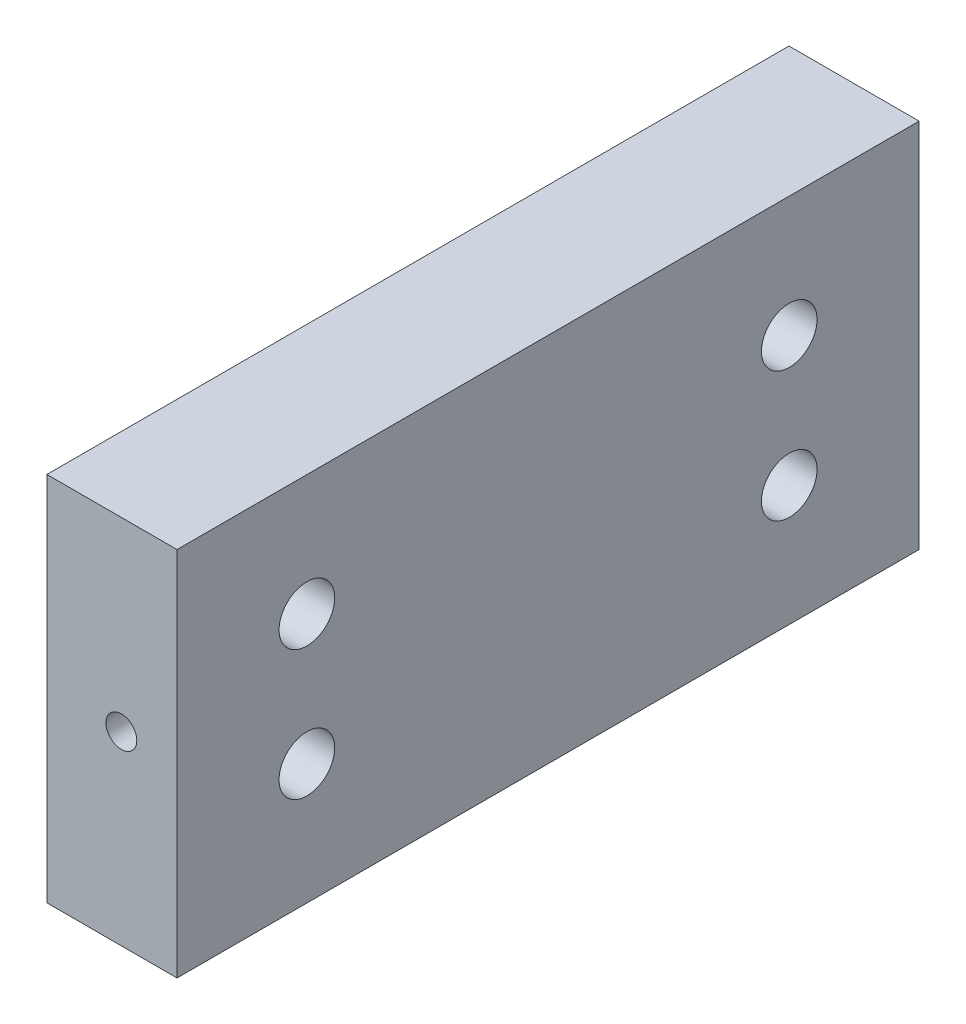
ISO-10303-21;
HEADER;
FILE_DESCRIPTION(('STEP AP214'),'2;1');
FILE_NAME('part.step','',(''),(''),'','','');
FILE_SCHEMA(('AUTOMOTIVE_DESIGN { 1 0 10303 214 1 1 1 1 }'));
ENDSEC;
DATA;
#1=APPLICATION_CONTEXT('core data for automotive mechanical design processes');
#2=APPLICATION_PROTOCOL_DEFINITION('international standard','automotive_design',2000,#1);
#3=PRODUCT_CONTEXT('',#1,'mechanical');
#4=PRODUCT('Part','Part','',(#3));
#5=PRODUCT_RELATED_PRODUCT_CATEGORY('part','',(#4));
#6=PRODUCT_DEFINITION_FORMATION('','',#4);
#7=PRODUCT_DEFINITION_CONTEXT('part definition',#1,'design');
#8=PRODUCT_DEFINITION('design','',#6,#7);
#9=PRODUCT_DEFINITION_SHAPE('','',#8);
#10=(LENGTH_UNIT() NAMED_UNIT(*) SI_UNIT(.MILLI.,.METRE.));
#11=(NAMED_UNIT(*) PLANE_ANGLE_UNIT() SI_UNIT($,.RADIAN.));
#12=(NAMED_UNIT(*) SI_UNIT($,.STERADIAN.) SOLID_ANGLE_UNIT());
#13=UNCERTAINTY_MEASURE_WITH_UNIT(LENGTH_MEASURE(1.E-05),#10,'distance_accuracy_value','');
#14=(GEOMETRIC_REPRESENTATION_CONTEXT(3) GLOBAL_UNCERTAINTY_ASSIGNED_CONTEXT((#13)) GLOBAL_UNIT_ASSIGNED_CONTEXT((#10,
#11,#12)) REPRESENTATION_CONTEXT('',''));
#15=CARTESIAN_POINT('',(0.,0.,0.));
#16=DIRECTION('',(0.,0.,1.));
#17=DIRECTION('',(1.,0.,0.));
#18=AXIS2_PLACEMENT_3D('',#15,#16,#17);
#19=CARTESIAN_POINT('',(-17.53472,-50.,200.));
#20=DIRECTION('',(1.,0.,0.));
#21=DIRECTION('',(0.,0.,-1.));
#22=AXIS2_PLACEMENT_3D('',#19,#20,#21);
#23=PLANE('',#22);
#24=CARTESIAN_POINT('',(-17.53472,-17.5,165.));
#25=DIRECTION('',(1.,0.,0.));
#26=DIRECTION('',(0.,0.,-1.));
#27=AXIS2_PLACEMENT_3D('',#24,#25,#26);
#28=CIRCLE('',#27,4.49999999999999);
#29=CARTESIAN_POINT('',(-17.53472,-17.5,160.5));
#30=VERTEX_POINT('',#29);
#31=EDGE_CURVE('E119',#30,#30,#28,.T.);
#32=ORIENTED_EDGE('',*,*,#31,.T.);
#33=EDGE_LOOP('',(#32));
#34=FACE_BOUND('',#33,.T.);
#35=CARTESIAN_POINT('',(-17.53472,-17.5,35.));
#36=DIRECTION('',(1.,0.,0.));
#37=DIRECTION('',(0.,0.,-1.));
#38=AXIS2_PLACEMENT_3D('',#35,#36,#37);
#39=CIRCLE('',#38,4.49999999999999);
#40=CARTESIAN_POINT('',(-17.53472,-17.5,30.5));
#41=VERTEX_POINT('',#40);
#42=EDGE_CURVE('E131',#41,#41,#39,.T.);
#43=ORIENTED_EDGE('',*,*,#42,.T.);
#44=EDGE_LOOP('',(#43));
#45=FACE_BOUND('',#44,.T.);
#46=CARTESIAN_POINT('',(-17.53472,17.5,35.));
#47=DIRECTION('',(1.,0.,0.));
#48=DIRECTION('',(0.,0.,-1.));
#49=AXIS2_PLACEMENT_3D('',#46,#47,#48);
#50=CIRCLE('',#49,4.49999999999999);
#51=CARTESIAN_POINT('',(-17.53472,17.5,30.5));
#52=VERTEX_POINT('',#51);
#53=EDGE_CURVE('E143',#52,#52,#50,.T.);
#54=ORIENTED_EDGE('',*,*,#53,.T.);
#55=EDGE_LOOP('',(#54));
#56=FACE_BOUND('',#55,.T.);
#57=CARTESIAN_POINT('',(-17.53472,17.5,165.));
#58=DIRECTION('',(1.,0.,0.));
#59=DIRECTION('',(0.,0.,-1.));
#60=AXIS2_PLACEMENT_3D('',#57,#58,#59);
#61=CIRCLE('',#60,4.49999999999999);
#62=CARTESIAN_POINT('',(-17.53472,17.5,160.5));
#63=VERTEX_POINT('',#62);
#64=EDGE_CURVE('E155',#63,#63,#61,.T.);
#65=ORIENTED_EDGE('',*,*,#64,.T.);
#66=EDGE_LOOP('',(#65));
#67=FACE_BOUND('',#66,.T.);
#68=DIRECTION('',(0.,-1.,0.));
#69=VECTOR('',#68,1.);
#70=CARTESIAN_POINT('',(-17.53472,-50.,0.));
#71=LINE('',#70,#69);
#72=CARTESIAN_POINT('',(-17.53472,50.,0.));
#73=VERTEX_POINT('',#72);
#74=CARTESIAN_POINT('',(-17.53472,-50.,0.));
#75=VERTEX_POINT('',#74);
#76=EDGE_CURVE('E158',#73,#75,#71,.T.);
#77=ORIENTED_EDGE('',*,*,#76,.T.);
#78=DIRECTION('',(0.,0.,-1.));
#79=VECTOR('',#78,1.);
#80=CARTESIAN_POINT('',(-17.53472,-50.,200.));
#81=LINE('',#80,#79);
#82=CARTESIAN_POINT('',(-17.53472,-50.,200.));
#83=VERTEX_POINT('',#82);
#84=EDGE_CURVE('E13',#83,#75,#81,.T.);
#85=ORIENTED_EDGE('',*,*,#84,.F.);
#86=DIRECTION('',(0.,-1.,0.));
#87=VECTOR('',#86,1.);
#88=CARTESIAN_POINT('',(-17.53472,-50.,200.));
#89=LINE('',#88,#87);
#90=CARTESIAN_POINT('',(-17.53472,50.,200.));
#91=VERTEX_POINT('',#90);
#92=EDGE_CURVE('E159',#91,#83,#89,.T.);
#93=ORIENTED_EDGE('',*,*,#92,.F.);
#94=DIRECTION('',(0.,0.,-1.));
#95=VECTOR('',#94,1.);
#96=CARTESIAN_POINT('',(-17.53472,50.,200.));
#97=LINE('',#96,#95);
#98=EDGE_CURVE('E165',#91,#73,#97,.T.);
#99=ORIENTED_EDGE('',*,*,#98,.T.);
#100=EDGE_LOOP('',(#77,#85,#93,#99));
#101=FACE_BOUND('',#100,.T.);
#102=ADVANCED_FACE('F44',(#34,#45,#56,#67,#101),#23,.F.);
#103=CARTESIAN_POINT('',(17.53472,-50.,200.));
#104=DIRECTION('',(0.,1.,0.));
#105=DIRECTION('',(-1.,0.,0.));
#106=AXIS2_PLACEMENT_3D('',#103,#104,#105);
#107=PLANE('',#106);
#108=DIRECTION('',(1.,0.,0.));
#109=VECTOR('',#108,1.);
#110=CARTESIAN_POINT('',(17.53472,-50.,0.));
#111=LINE('',#110,#109);
#112=CARTESIAN_POINT('',(17.53472,-50.,0.));
#113=VERTEX_POINT('',#112);
#114=EDGE_CURVE('E168',#75,#113,#111,.T.);
#115=ORIENTED_EDGE('',*,*,#114,.T.);
#116=DIRECTION('',(0.,0.,-1.));
#117=VECTOR('',#116,1.);
#118=CARTESIAN_POINT('',(17.53472,-50.,200.));
#119=LINE('',#118,#117);
#120=CARTESIAN_POINT('',(17.53472,-50.,200.));
#121=VERTEX_POINT('',#120);
#122=EDGE_CURVE('E52',#121,#113,#119,.T.);
#123=ORIENTED_EDGE('',*,*,#122,.F.);
#124=DIRECTION('',(1.,0.,0.));
#125=VECTOR('',#124,1.);
#126=CARTESIAN_POINT('',(17.53472,-50.,200.));
#127=LINE('',#126,#125);
#128=EDGE_CURVE('E91',#83,#121,#127,.T.);
#129=ORIENTED_EDGE('',*,*,#128,.F.);
#130=ORIENTED_EDGE('',*,*,#84,.T.);
#131=EDGE_LOOP('',(#115,#123,#129,#130));
#132=FACE_BOUND('',#131,.T.);
#133=ADVANCED_FACE('F193',(#132),#107,.F.);
#134=CARTESIAN_POINT('',(17.53472,-50.,200.));
#135=DIRECTION('',(-1.,0.,0.));
#136=DIRECTION('',(0.,0.,1.));
#137=AXIS2_PLACEMENT_3D('',#134,#135,#136);
#138=PLANE('',#137);
#139=CARTESIAN_POINT('',(17.53472,-17.5,165.));
#140=DIRECTION('',(1.,0.,0.));
#141=DIRECTION('',(0.,0.,-1.));
#142=AXIS2_PLACEMENT_3D('',#139,#140,#141);
#143=CIRCLE('',#142,7.5);
#144=CARTESIAN_POINT('',(17.53472,-17.5,157.5));
#145=VERTEX_POINT('',#144);
#146=EDGE_CURVE('E105',#145,#145,#143,.T.);
#147=ORIENTED_EDGE('',*,*,#146,.F.);
#148=EDGE_LOOP('',(#147));
#149=FACE_BOUND('',#148,.T.);
#150=CARTESIAN_POINT('',(17.53472,-17.5,35.));
#151=DIRECTION('',(1.,0.,0.));
#152=DIRECTION('',(0.,0.,-1.));
#153=AXIS2_PLACEMENT_3D('',#150,#151,#152);
#154=CIRCLE('',#153,7.5);
#155=CARTESIAN_POINT('',(17.53472,-17.5,27.5));
#156=VERTEX_POINT('',#155);
#157=EDGE_CURVE('E122',#156,#156,#154,.T.);
#158=ORIENTED_EDGE('',*,*,#157,.F.);
#159=EDGE_LOOP('',(#158));
#160=FACE_BOUND('',#159,.T.);
#161=CARTESIAN_POINT('',(17.53472,17.5,35.));
#162=DIRECTION('',(1.,0.,0.));
#163=DIRECTION('',(0.,0.,-1.));
#164=AXIS2_PLACEMENT_3D('',#161,#162,#163);
#165=CIRCLE('',#164,7.5);
#166=CARTESIAN_POINT('',(17.53472,17.5,27.5));
#167=VERTEX_POINT('',#166);
#168=EDGE_CURVE('E134',#167,#167,#165,.T.);
#169=ORIENTED_EDGE('',*,*,#168,.F.);
#170=EDGE_LOOP('',(#169));
#171=FACE_BOUND('',#170,.T.);
#172=CARTESIAN_POINT('',(17.53472,17.5,165.));
#173=DIRECTION('',(1.,0.,0.));
#174=DIRECTION('',(0.,0.,-1.));
#175=AXIS2_PLACEMENT_3D('',#172,#173,#174);
#176=CIRCLE('',#175,7.5);
#177=CARTESIAN_POINT('',(17.53472,17.5,157.5));
#178=VERTEX_POINT('',#177);
#179=EDGE_CURVE('E146',#178,#178,#176,.T.);
#180=ORIENTED_EDGE('',*,*,#179,.F.);
#181=EDGE_LOOP('',(#180));
#182=FACE_BOUND('',#181,.T.);
#183=DIRECTION('',(0.,1.,0.));
#184=VECTOR('',#183,1.);
#185=CARTESIAN_POINT('',(17.53472,-50.,0.));
#186=LINE('',#185,#184);
#187=CARTESIAN_POINT('',(17.53472,50.,0.));
#188=VERTEX_POINT('',#187);
#189=EDGE_CURVE('E78',#113,#188,#186,.T.);
#190=ORIENTED_EDGE('',*,*,#189,.T.);
#191=DIRECTION('',(0.,0.,-1.));
#192=VECTOR('',#191,1.);
#193=CARTESIAN_POINT('',(17.53472,50.,200.));
#194=LINE('',#193,#192);
#195=CARTESIAN_POINT('',(17.53472,50.,200.));
#196=VERTEX_POINT('',#195);
#197=EDGE_CURVE('E173',#196,#188,#194,.T.);
#198=ORIENTED_EDGE('',*,*,#197,.F.);
#199=DIRECTION('',(0.,1.,0.));
#200=VECTOR('',#199,1.);
#201=CARTESIAN_POINT('',(17.53472,-50.,200.));
#202=LINE('',#201,#200);
#203=EDGE_CURVE('E162',#121,#196,#202,.T.);
#204=ORIENTED_EDGE('',*,*,#203,.F.);
#205=ORIENTED_EDGE('',*,*,#122,.T.);
#206=EDGE_LOOP('',(#190,#198,#204,#205));
#207=FACE_BOUND('',#206,.T.);
#208=ADVANCED_FACE('F175',(#149,#160,#171,#182,#207),#138,.F.);
#209=CARTESIAN_POINT('',(17.53472,50.,200.));
#210=DIRECTION('',(0.,-1.,0.));
#211=DIRECTION('',(0.,0.,-1.));
#212=AXIS2_PLACEMENT_3D('',#209,#210,#211);
#213=PLANE('',#212);
#214=DIRECTION('',(-1.,0.,0.));
#215=VECTOR('',#214,1.);
#216=CARTESIAN_POINT('',(17.53472,50.,0.));
#217=LINE('',#216,#215);
#218=EDGE_CURVE('E84',#188,#73,#217,.T.);
#219=ORIENTED_EDGE('',*,*,#218,.T.);
#220=ORIENTED_EDGE('',*,*,#98,.F.);
#221=DIRECTION('',(-1.,0.,0.));
#222=VECTOR('',#221,1.);
#223=CARTESIAN_POINT('',(17.53472,50.,200.));
#224=LINE('',#223,#222);
#225=EDGE_CURVE('E60',#196,#91,#224,.T.);
#226=ORIENTED_EDGE('',*,*,#225,.F.);
#227=ORIENTED_EDGE('',*,*,#197,.T.);
#228=EDGE_LOOP('',(#219,#220,#226,#227));
#229=FACE_BOUND('',#228,.T.);
#230=ADVANCED_FACE('F182',(#229),#213,.F.);
#231=CARTESIAN_POINT('',(0.,0.,200.));
#232=DIRECTION('',(0.,0.,1.));
#233=DIRECTION('',(1.,0.,0.));
#234=AXIS2_PLACEMENT_3D('',#231,#232,#233);
#235=PLANE('',#234);
#236=CARTESIAN_POINT('',(2.53472000000006,0.,200.));
#237=DIRECTION('',(0.,0.,1.));
#238=DIRECTION('',(1.,0.,0.));
#239=AXIS2_PLACEMENT_3D('',#236,#237,#238);
#240=CIRCLE('',#239,4.14999999999999);
#241=CARTESIAN_POINT('',(6.68472000000005,0.,200.));
#242=VERTEX_POINT('',#241);
#243=EDGE_CURVE('E106',#242,#242,#240,.T.);
#244=ORIENTED_EDGE('',*,*,#243,.F.);
#245=EDGE_LOOP('',(#244));
#246=FACE_BOUND('',#245,.T.);
#247=ORIENTED_EDGE('',*,*,#92,.T.);
#248=ORIENTED_EDGE('',*,*,#128,.T.);
#249=ORIENTED_EDGE('',*,*,#203,.T.);
#250=ORIENTED_EDGE('',*,*,#225,.T.);
#251=EDGE_LOOP('',(#247,#248,#249,#250));
#252=FACE_BOUND('',#251,.T.);
#253=ADVANCED_FACE('F184',(#246,#252),#235,.T.);
#254=CARTESIAN_POINT('',(0.,0.,0.));
#255=DIRECTION('',(0.,0.,1.));
#256=DIRECTION('',(1.,0.,0.));
#257=AXIS2_PLACEMENT_3D('',#254,#255,#256);
#258=PLANE('',#257);
#259=ORIENTED_EDGE('',*,*,#76,.F.);
#260=ORIENTED_EDGE('',*,*,#218,.F.);
#261=ORIENTED_EDGE('',*,*,#189,.F.);
#262=ORIENTED_EDGE('',*,*,#114,.F.);
#263=EDGE_LOOP('',(#259,#260,#261,#262));
#264=FACE_BOUND('',#263,.T.);
#265=ADVANCED_FACE('F178',(#264),#258,.F.);
#266=CARTESIAN_POINT('',(17.53472,17.5,165.));
#267=DIRECTION('',(1.,0.,0.));
#268=DIRECTION('',(0.,0.,-1.));
#269=AXIS2_PLACEMENT_3D('',#266,#267,#268);
#270=CYLINDRICAL_SURFACE('',#269,4.5);
#271=ORIENTED_EDGE('',*,*,#64,.F.);
#272=EDGE_LOOP('',(#271));
#273=FACE_BOUND('',#272,.T.);
#274=CARTESIAN_POINT('',(-7.46527999999998,17.5,165.));
#275=DIRECTION('',(1.,0.,0.));
#276=DIRECTION('',(0.,0.,-1.));
#277=AXIS2_PLACEMENT_3D('',#274,#275,#276);
#278=CIRCLE('',#277,4.5);
#279=CARTESIAN_POINT('',(-7.46527999999998,17.5,160.5));
#280=VERTEX_POINT('',#279);
#281=EDGE_CURVE('E152',#280,#280,#278,.T.);
#282=ORIENTED_EDGE('',*,*,#281,.T.);
#283=EDGE_LOOP('',(#282));
#284=FACE_BOUND('',#283,.T.);
#285=ADVANCED_FACE('F210',(#273,#284),#270,.F.);
#286=CARTESIAN_POINT('',(-7.46527999999998,22.,165.));
#287=DIRECTION('',(-1.,0.,0.));
#288=DIRECTION('',(0.,0.,1.));
#289=AXIS2_PLACEMENT_3D('',#286,#287,#288);
#290=PLANE('',#289);
#291=ORIENTED_EDGE('',*,*,#281,.F.);
#292=EDGE_LOOP('',(#291));
#293=FACE_BOUND('',#292,.T.);
#294=CARTESIAN_POINT('',(-7.46527999999998,17.5,165.));
#295=DIRECTION('',(1.,0.,0.));
#296=DIRECTION('',(0.,0.,-1.));
#297=AXIS2_PLACEMENT_3D('',#294,#295,#296);
#298=CIRCLE('',#297,7.49999999999999);
#299=CARTESIAN_POINT('',(-7.46527999999998,17.5,157.5));
#300=VERTEX_POINT('',#299);
#301=EDGE_CURVE('E149',#300,#300,#298,.T.);
#302=ORIENTED_EDGE('',*,*,#301,.T.);
#303=EDGE_LOOP('',(#302));
#304=FACE_BOUND('',#303,.T.);
#305=ADVANCED_FACE('F213',(#293,#304),#290,.F.);
#306=CARTESIAN_POINT('',(17.53472,17.5,165.));
#307=DIRECTION('',(1.,0.,0.));
#308=DIRECTION('',(0.,0.,-1.));
#309=AXIS2_PLACEMENT_3D('',#306,#307,#308);
#310=CYLINDRICAL_SURFACE('',#309,7.49999999999999);
#311=ORIENTED_EDGE('',*,*,#301,.F.);
#312=EDGE_LOOP('',(#311));
#313=FACE_BOUND('',#312,.T.);
#314=ORIENTED_EDGE('',*,*,#179,.T.);
#315=EDGE_LOOP('',(#314));
#316=FACE_BOUND('',#315,.T.);
#317=ADVANCED_FACE('F219',(#313,#316),#310,.F.);
#318=CARTESIAN_POINT('',(17.53472,17.5,35.));
#319=DIRECTION('',(1.,0.,0.));
#320=DIRECTION('',(0.,0.,-1.));
#321=AXIS2_PLACEMENT_3D('',#318,#319,#320);
#322=CYLINDRICAL_SURFACE('',#321,4.5);
#323=ORIENTED_EDGE('',*,*,#53,.F.);
#324=EDGE_LOOP('',(#323));
#325=FACE_BOUND('',#324,.T.);
#326=CARTESIAN_POINT('',(-7.46527999999998,17.5,35.));
#327=DIRECTION('',(1.,0.,0.));
#328=DIRECTION('',(0.,0.,-1.));
#329=AXIS2_PLACEMENT_3D('',#326,#327,#328);
#330=CIRCLE('',#329,4.5);
#331=CARTESIAN_POINT('',(-7.46527999999998,17.5,30.5));
#332=VERTEX_POINT('',#331);
#333=EDGE_CURVE('E140',#332,#332,#330,.T.);
#334=ORIENTED_EDGE('',*,*,#333,.T.);
#335=EDGE_LOOP('',(#334));
#336=FACE_BOUND('',#335,.T.);
#337=ADVANCED_FACE('F225',(#325,#336),#322,.F.);
#338=CARTESIAN_POINT('',(-7.46527999999998,22.,35.));
#339=DIRECTION('',(-1.,0.,0.));
#340=DIRECTION('',(0.,0.,1.));
#341=AXIS2_PLACEMENT_3D('',#338,#339,#340);
#342=PLANE('',#341);
#343=ORIENTED_EDGE('',*,*,#333,.F.);
#344=EDGE_LOOP('',(#343));
#345=FACE_BOUND('',#344,.T.);
#346=CARTESIAN_POINT('',(-7.46527999999998,17.5,35.));
#347=DIRECTION('',(1.,0.,0.));
#348=DIRECTION('',(0.,0.,-1.));
#349=AXIS2_PLACEMENT_3D('',#346,#347,#348);
#350=CIRCLE('',#349,7.49999999999999);
#351=CARTESIAN_POINT('',(-7.46527999999998,17.5,27.5));
#352=VERTEX_POINT('',#351);
#353=EDGE_CURVE('E137',#352,#352,#350,.T.);
#354=ORIENTED_EDGE('',*,*,#353,.T.);
#355=EDGE_LOOP('',(#354));
#356=FACE_BOUND('',#355,.T.);
#357=ADVANCED_FACE('F232',(#345,#356),#342,.F.);
#358=CARTESIAN_POINT('',(17.53472,17.5,35.));
#359=DIRECTION('',(1.,0.,0.));
#360=DIRECTION('',(0.,0.,-1.));
#361=AXIS2_PLACEMENT_3D('',#358,#359,#360);
#362=CYLINDRICAL_SURFACE('',#361,7.49999999999999);
#363=ORIENTED_EDGE('',*,*,#353,.F.);
#364=EDGE_LOOP('',(#363));
#365=FACE_BOUND('',#364,.T.);
#366=ORIENTED_EDGE('',*,*,#168,.T.);
#367=EDGE_LOOP('',(#366));
#368=FACE_BOUND('',#367,.T.);
#369=ADVANCED_FACE('F268',(#365,#368),#362,.F.);
#370=CARTESIAN_POINT('',(17.53472,-17.5,35.));
#371=DIRECTION('',(1.,0.,0.));
#372=DIRECTION('',(0.,0.,-1.));
#373=AXIS2_PLACEMENT_3D('',#370,#371,#372);
#374=CYLINDRICAL_SURFACE('',#373,4.49999999999999);
#375=ORIENTED_EDGE('',*,*,#42,.F.);
#376=EDGE_LOOP('',(#375));
#377=FACE_BOUND('',#376,.T.);
#378=CARTESIAN_POINT('',(-7.46527999999998,-17.5,35.));
#379=DIRECTION('',(1.,0.,0.));
#380=DIRECTION('',(0.,0.,-1.));
#381=AXIS2_PLACEMENT_3D('',#378,#379,#380);
#382=CIRCLE('',#381,4.5);
#383=CARTESIAN_POINT('',(-7.46527999999998,-17.5,30.5));
#384=VERTEX_POINT('',#383);
#385=EDGE_CURVE('E128',#384,#384,#382,.T.);
#386=ORIENTED_EDGE('',*,*,#385,.T.);
#387=EDGE_LOOP('',(#386));
#388=FACE_BOUND('',#387,.T.);
#389=ADVANCED_FACE('F276',(#377,#388),#374,.F.);
#390=CARTESIAN_POINT('',(-7.46527999999998,-13.,35.));
#391=DIRECTION('',(-1.,0.,0.));
#392=DIRECTION('',(0.,0.,1.));
#393=AXIS2_PLACEMENT_3D('',#390,#391,#392);
#394=PLANE('',#393);
#395=ORIENTED_EDGE('',*,*,#385,.F.);
#396=EDGE_LOOP('',(#395));
#397=FACE_BOUND('',#396,.T.);
#398=CARTESIAN_POINT('',(-7.46527999999998,-17.5,35.));
#399=DIRECTION('',(1.,0.,0.));
#400=DIRECTION('',(0.,0.,-1.));
#401=AXIS2_PLACEMENT_3D('',#398,#399,#400);
#402=CIRCLE('',#401,7.49999999999999);
#403=CARTESIAN_POINT('',(-7.46527999999998,-17.5,27.5));
#404=VERTEX_POINT('',#403);
#405=EDGE_CURVE('E125',#404,#404,#402,.T.);
#406=ORIENTED_EDGE('',*,*,#405,.T.);
#407=EDGE_LOOP('',(#406));
#408=FACE_BOUND('',#407,.T.);
#409=ADVANCED_FACE('F299',(#397,#408),#394,.F.);
#410=CARTESIAN_POINT('',(17.53472,-17.5,35.));
#411=DIRECTION('',(1.,0.,0.));
#412=DIRECTION('',(0.,0.,-1.));
#413=AXIS2_PLACEMENT_3D('',#410,#411,#412);
#414=CYLINDRICAL_SURFACE('',#413,7.5);
#415=ORIENTED_EDGE('',*,*,#405,.F.);
#416=EDGE_LOOP('',(#415));
#417=FACE_BOUND('',#416,.T.);
#418=ORIENTED_EDGE('',*,*,#157,.T.);
#419=EDGE_LOOP('',(#418));
#420=FACE_BOUND('',#419,.T.);
#421=ADVANCED_FACE('F309',(#417,#420),#414,.F.);
#422=CARTESIAN_POINT('',(17.53472,-17.5,165.));
#423=DIRECTION('',(1.,0.,0.));
#424=DIRECTION('',(0.,0.,-1.));
#425=AXIS2_PLACEMENT_3D('',#422,#423,#424);
#426=CYLINDRICAL_SURFACE('',#425,4.49999999999999);
#427=ORIENTED_EDGE('',*,*,#31,.F.);
#428=EDGE_LOOP('',(#427));
#429=FACE_BOUND('',#428,.T.);
#430=CARTESIAN_POINT('',(-7.46527999999998,-17.5,165.));
#431=DIRECTION('',(1.,0.,0.));
#432=DIRECTION('',(0.,0.,-1.));
#433=AXIS2_PLACEMENT_3D('',#430,#431,#432);
#434=CIRCLE('',#433,4.5);
#435=CARTESIAN_POINT('',(-7.46527999999998,-17.5,160.5));
#436=VERTEX_POINT('',#435);
#437=EDGE_CURVE('E116',#436,#436,#434,.T.);
#438=ORIENTED_EDGE('',*,*,#437,.T.);
#439=EDGE_LOOP('',(#438));
#440=FACE_BOUND('',#439,.T.);
#441=ADVANCED_FACE('F319',(#429,#440),#426,.F.);
#442=CARTESIAN_POINT('',(-7.46527999999998,-13.,165.));
#443=DIRECTION('',(-1.,0.,0.));
#444=DIRECTION('',(0.,0.,1.));
#445=AXIS2_PLACEMENT_3D('',#442,#443,#444);
#446=PLANE('',#445);
#447=ORIENTED_EDGE('',*,*,#437,.F.);
#448=EDGE_LOOP('',(#447));
#449=FACE_BOUND('',#448,.T.);
#450=CARTESIAN_POINT('',(-7.46527999999998,-17.5,165.));
#451=DIRECTION('',(1.,0.,0.));
#452=DIRECTION('',(0.,0.,-1.));
#453=AXIS2_PLACEMENT_3D('',#450,#451,#452);
#454=CIRCLE('',#453,7.49999999999999);
#455=CARTESIAN_POINT('',(-7.46527999999998,-17.5,157.5));
#456=VERTEX_POINT('',#455);
#457=EDGE_CURVE('E109',#456,#456,#454,.T.);
#458=ORIENTED_EDGE('',*,*,#457,.T.);
#459=EDGE_LOOP('',(#458));
#460=FACE_BOUND('',#459,.T.);
#461=ADVANCED_FACE('F329',(#449,#460),#446,.F.);
#462=CARTESIAN_POINT('',(17.53472,-17.5,165.));
#463=DIRECTION('',(1.,0.,0.));
#464=DIRECTION('',(0.,0.,-1.));
#465=AXIS2_PLACEMENT_3D('',#462,#463,#464);
#466=CYLINDRICAL_SURFACE('',#465,7.5);
#467=ORIENTED_EDGE('',*,*,#457,.F.);
#468=EDGE_LOOP('',(#467));
#469=FACE_BOUND('',#468,.T.);
#470=ORIENTED_EDGE('',*,*,#146,.T.);
#471=EDGE_LOOP('',(#470));
#472=FACE_BOUND('',#471,.T.);
#473=ADVANCED_FACE('F99',(#469,#472),#466,.F.);
#474=CARTESIAN_POINT('',(2.53472000000006,0.,180.));
#475=DIRECTION('',(0.,0.,1.));
#476=DIRECTION('',(1.,0.,0.));
#477=AXIS2_PLACEMENT_3D('',#474,#475,#476);
#478=CONICAL_SURFACE('',#477,4.14999999999999,1.02974425867666);
#479=CARTESIAN_POINT('',(2.53472000000005,0.,177.506428431036));
#480=VERTEX_POINT('',#479);
#481=VERTEX_LOOP('',#480);
#482=FACE_BOUND('',#481,.T.);
#483=CARTESIAN_POINT('',(2.53472000000006,0.,180.));
#484=DIRECTION('',(0.,0.,1.));
#485=DIRECTION('',(1.,0.,0.));
#486=AXIS2_PLACEMENT_3D('',#483,#484,#485);
#487=CIRCLE('',#486,4.14999999999999);
#488=CARTESIAN_POINT('',(6.68472000000005,0.,180.));
#489=VERTEX_POINT('',#488);
#490=EDGE_CURVE('E103',#489,#489,#487,.T.);
#491=ORIENTED_EDGE('',*,*,#490,.T.);
#492=EDGE_LOOP('',(#491));
#493=FACE_BOUND('',#492,.T.);
#494=ADVANCED_FACE('F95',(#482,#493),#478,.F.);
#495=CARTESIAN_POINT('',(2.53472000000006,0.,200.));
#496=DIRECTION('',(0.,0.,1.));
#497=DIRECTION('',(1.,0.,0.));
#498=AXIS2_PLACEMENT_3D('',#495,#496,#497);
#499=CYLINDRICAL_SURFACE('',#498,4.14999999999999);
#500=ORIENTED_EDGE('',*,*,#490,.F.);
#501=EDGE_LOOP('',(#500));
#502=FACE_BOUND('',#501,.T.);
#503=ORIENTED_EDGE('',*,*,#243,.T.);
#504=EDGE_LOOP('',(#503));
#505=FACE_BOUND('',#504,.T.);
#506=ADVANCED_FACE('F98',(#502,#505),#499,.F.);
#507=CLOSED_SHELL('',(#102,#133,#208,#230,#253,#265,#285,#305,#317,#337,#357,#369,#389,#409,
#421,#441,#461,#473,#494,#506));
#508=MANIFOLD_SOLID_BREP('B2',#507);
#509=ADVANCED_BREP_SHAPE_REPRESENTATION('',(#18,#508),#14);
#510=SHAPE_DEFINITION_REPRESENTATION(#9,#509);
ENDSEC;
END-ISO-10303-21;
